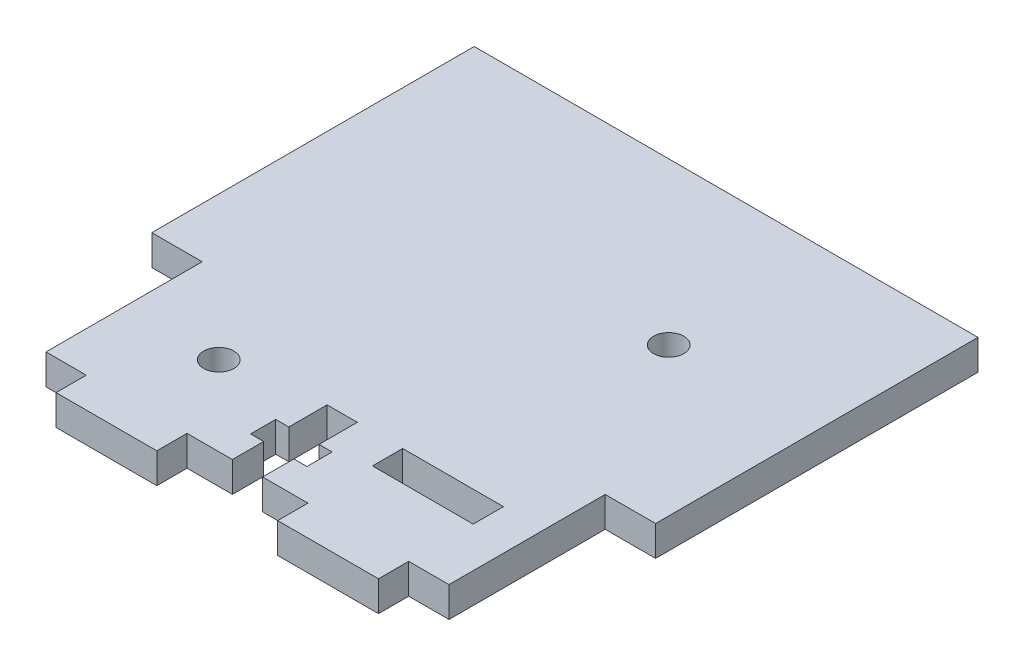
ISO-10303-21;
HEADER;
FILE_DESCRIPTION(('STEP AP214'),'2;1');
FILE_NAME('part.step','',(''),(''),'','','');
FILE_SCHEMA(('AUTOMOTIVE_DESIGN { 1 0 10303 214 1 1 1 1 }'));
ENDSEC;
DATA;
#1=APPLICATION_CONTEXT('core data for automotive mechanical design processes');
#2=APPLICATION_PROTOCOL_DEFINITION('international standard','automotive_design',2000,#1);
#3=PRODUCT_CONTEXT('',#1,'mechanical');
#4=PRODUCT('Part','Part','',(#3));
#5=PRODUCT_RELATED_PRODUCT_CATEGORY('part','',(#4));
#6=PRODUCT_DEFINITION_FORMATION('','',#4);
#7=PRODUCT_DEFINITION_CONTEXT('part definition',#1,'design');
#8=PRODUCT_DEFINITION('design','',#6,#7);
#9=PRODUCT_DEFINITION_SHAPE('','',#8);
#10=(LENGTH_UNIT() NAMED_UNIT(*) SI_UNIT(.MILLI.,.METRE.));
#11=(NAMED_UNIT(*) PLANE_ANGLE_UNIT() SI_UNIT($,.RADIAN.));
#12=(NAMED_UNIT(*) SI_UNIT($,.STERADIAN.) SOLID_ANGLE_UNIT());
#13=UNCERTAINTY_MEASURE_WITH_UNIT(LENGTH_MEASURE(1.E-05),#10,'distance_accuracy_value','');
#14=(GEOMETRIC_REPRESENTATION_CONTEXT(3) GLOBAL_UNCERTAINTY_ASSIGNED_CONTEXT((#13)) GLOBAL_UNIT_ASSIGNED_CONTEXT((#10,
#11,#12)) REPRESENTATION_CONTEXT('',''));
#15=CARTESIAN_POINT('',(0.,0.,0.));
#16=DIRECTION('',(0.,0.,1.));
#17=DIRECTION('',(1.,0.,0.));
#18=AXIS2_PLACEMENT_3D('',#15,#16,#17);
#19=CARTESIAN_POINT('',(0.,3.,0.));
#20=DIRECTION('',(0.,-1.,0.));
#21=DIRECTION('',(0.,0.,-1.));
#22=AXIS2_PLACEMENT_3D('',#19,#20,#21);
#23=PLANE('',#22);
#24=DIRECTION('',(0.,0.,-1.));
#25=VECTOR('',#24,1.);
#26=CARTESIAN_POINT('',(0.,3.,0.));
#27=LINE('',#26,#25);
#28=CARTESIAN_POINT('',(0.,3.,0.));
#29=VERTEX_POINT('',#28);
#30=CARTESIAN_POINT('',(0.,3.,-15.5));
#31=VERTEX_POINT('',#30);
#32=EDGE_CURVE('E281',#29,#31,#27,.T.);
#33=ORIENTED_EDGE('',*,*,#32,.T.);
#34=DIRECTION('',(1.,0.,0.));
#35=VECTOR('',#34,1.);
#36=CARTESIAN_POINT('',(0.,3.,-15.5));
#37=LINE('',#36,#35);
#38=CARTESIAN_POINT('',(4.99999999999999,3.,-15.5));
#39=VERTEX_POINT('',#38);
#40=EDGE_CURVE('E284',#31,#39,#37,.T.);
#41=ORIENTED_EDGE('',*,*,#40,.T.);
#42=DIRECTION('',(0.,0.,-1.));
#43=VECTOR('',#42,1.);
#44=CARTESIAN_POINT('',(4.99999999999999,3.,-15.5));
#45=LINE('',#44,#43);
#46=CARTESIAN_POINT('',(5.,3.,-47.5));
#47=VERTEX_POINT('',#46);
#48=EDGE_CURVE('E287',#39,#47,#45,.T.);
#49=ORIENTED_EDGE('',*,*,#48,.T.);
#50=DIRECTION('',(-1.,0.,0.));
#51=VECTOR('',#50,1.);
#52=CARTESIAN_POINT('',(5.,3.,-47.5));
#53=LINE('',#52,#51);
#54=CARTESIAN_POINT('',(-45.,3.,-47.5));
#55=VERTEX_POINT('',#54);
#56=EDGE_CURVE('E289',#47,#55,#53,.T.);
#57=ORIENTED_EDGE('',*,*,#56,.T.);
#58=DIRECTION('',(0.,0.,1.));
#59=VECTOR('',#58,1.);
#60=CARTESIAN_POINT('',(-45.,3.,-47.5));
#61=LINE('',#60,#59);
#62=CARTESIAN_POINT('',(-45.,3.,-15.5));
#63=VERTEX_POINT('',#62);
#64=EDGE_CURVE('E291',#55,#63,#61,.T.);
#65=ORIENTED_EDGE('',*,*,#64,.T.);
#66=DIRECTION('',(1.,0.,0.));
#67=VECTOR('',#66,1.);
#68=CARTESIAN_POINT('',(-45.,3.,-15.5));
#69=LINE('',#68,#67);
#70=CARTESIAN_POINT('',(-40.,3.,-15.5));
#71=VERTEX_POINT('',#70);
#72=EDGE_CURVE('E293',#63,#71,#69,.T.);
#73=ORIENTED_EDGE('',*,*,#72,.T.);
#74=DIRECTION('',(0.,0.,1.));
#75=VECTOR('',#74,1.);
#76=CARTESIAN_POINT('',(-40.,3.,0.));
#77=LINE('',#76,#75);
#78=CARTESIAN_POINT('',(-40.,3.,0.));
#79=VERTEX_POINT('',#78);
#80=EDGE_CURVE('E295',#71,#79,#77,.T.);
#81=ORIENTED_EDGE('',*,*,#80,.T.);
#82=DIRECTION('',(1.,0.,0.));
#83=VECTOR('',#82,1.);
#84=CARTESIAN_POINT('',(-36.,3.,0.));
#85=LINE('',#84,#83);
#86=CARTESIAN_POINT('',(-36.,3.,0.));
#87=VERTEX_POINT('',#86);
#88=EDGE_CURVE('E297',#79,#87,#85,.T.);
#89=ORIENTED_EDGE('',*,*,#88,.T.);
#90=DIRECTION('',(0.,0.,1.));
#91=VECTOR('',#90,1.);
#92=CARTESIAN_POINT('',(-36.,3.,0.));
#93=LINE('',#92,#91);
#94=CARTESIAN_POINT('',(-36.,3.,3.));
#95=VERTEX_POINT('',#94);
#96=EDGE_CURVE('E299',#87,#95,#93,.T.);
#97=ORIENTED_EDGE('',*,*,#96,.T.);
#98=DIRECTION('',(1.,0.,0.));
#99=VECTOR('',#98,1.);
#100=CARTESIAN_POINT('',(-36.,3.,3.));
#101=LINE('',#100,#99);
#102=CARTESIAN_POINT('',(-26.,3.,3.));
#103=VERTEX_POINT('',#102);
#104=EDGE_CURVE('E301',#95,#103,#101,.T.);
#105=ORIENTED_EDGE('',*,*,#104,.T.);
#106=DIRECTION('',(0.,0.,-1.));
#107=VECTOR('',#106,1.);
#108=CARTESIAN_POINT('',(-26.,3.,3.));
#109=LINE('',#108,#107);
#110=CARTESIAN_POINT('',(-26.,3.,0.));
#111=VERTEX_POINT('',#110);
#112=EDGE_CURVE('E303',#103,#111,#109,.T.);
#113=ORIENTED_EDGE('',*,*,#112,.T.);
#114=DIRECTION('',(1.,0.,0.));
#115=VECTOR('',#114,1.);
#116=CARTESIAN_POINT('',(-21.5,3.,0.));
#117=LINE('',#116,#115);
#118=CARTESIAN_POINT('',(-21.5,3.,0.));
#119=VERTEX_POINT('',#118);
#120=EDGE_CURVE('E305',#111,#119,#117,.T.);
#121=ORIENTED_EDGE('',*,*,#120,.T.);
#122=DIRECTION('',(0.,0.,-1.));
#123=VECTOR('',#122,1.);
#124=CARTESIAN_POINT('',(-21.5,3.,-3.1));
#125=LINE('',#124,#123);
#126=CARTESIAN_POINT('',(-21.5,3.,-3.1));
#127=VERTEX_POINT('',#126);
#128=EDGE_CURVE('E307',#119,#127,#125,.T.);
#129=ORIENTED_EDGE('',*,*,#128,.T.);
#130=DIRECTION('',(-1.,0.,0.));
#131=VECTOR('',#130,1.);
#132=CARTESIAN_POINT('',(-22.8,3.,-3.1));
#133=LINE('',#132,#131);
#134=CARTESIAN_POINT('',(-22.8,3.,-3.1));
#135=VERTEX_POINT('',#134);
#136=EDGE_CURVE('E309',#127,#135,#133,.T.);
#137=ORIENTED_EDGE('',*,*,#136,.T.);
#138=DIRECTION('',(0.,0.,-1.));
#139=VECTOR('',#138,1.);
#140=CARTESIAN_POINT('',(-22.8,3.,-5.6));
#141=LINE('',#140,#139);
#142=CARTESIAN_POINT('',(-22.8,3.,-5.6));
#143=VERTEX_POINT('',#142);
#144=EDGE_CURVE('E311',#135,#143,#141,.T.);
#145=ORIENTED_EDGE('',*,*,#144,.T.);
#146=DIRECTION('',(1.,0.,0.));
#147=VECTOR('',#146,1.);
#148=CARTESIAN_POINT('',(-21.5,3.,-5.6));
#149=LINE('',#148,#147);
#150=CARTESIAN_POINT('',(-21.5,3.,-5.6));
#151=VERTEX_POINT('',#150);
#152=EDGE_CURVE('E313',#143,#151,#149,.T.);
#153=ORIENTED_EDGE('',*,*,#152,.T.);
#154=DIRECTION('',(0.,0.,-1.));
#155=VECTOR('',#154,1.);
#156=CARTESIAN_POINT('',(-21.5,3.,-9.4));
#157=LINE('',#156,#155);
#158=CARTESIAN_POINT('',(-21.5,3.,-9.4));
#159=VERTEX_POINT('',#158);
#160=EDGE_CURVE('E315',#151,#159,#157,.T.);
#161=ORIENTED_EDGE('',*,*,#160,.T.);
#162=DIRECTION('',(1.,0.,0.));
#163=VECTOR('',#162,1.);
#164=CARTESIAN_POINT('',(-18.5,3.,-9.4));
#165=LINE('',#164,#163);
#166=CARTESIAN_POINT('',(-18.5,3.,-9.4));
#167=VERTEX_POINT('',#166);
#168=EDGE_CURVE('E317',#159,#167,#165,.T.);
#169=ORIENTED_EDGE('',*,*,#168,.T.);
#170=DIRECTION('',(0.,0.,1.));
#171=VECTOR('',#170,1.);
#172=CARTESIAN_POINT('',(-18.5,3.,-5.6));
#173=LINE('',#172,#171);
#174=CARTESIAN_POINT('',(-18.5,3.,-5.6));
#175=VERTEX_POINT('',#174);
#176=EDGE_CURVE('E319',#167,#175,#173,.T.);
#177=ORIENTED_EDGE('',*,*,#176,.T.);
#178=DIRECTION('',(1.,0.,0.));
#179=VECTOR('',#178,1.);
#180=CARTESIAN_POINT('',(-17.2,3.,-5.6));
#181=LINE('',#180,#179);
#182=CARTESIAN_POINT('',(-17.2,3.,-5.6));
#183=VERTEX_POINT('',#182);
#184=EDGE_CURVE('E321',#175,#183,#181,.T.);
#185=ORIENTED_EDGE('',*,*,#184,.T.);
#186=DIRECTION('',(0.,0.,1.));
#187=VECTOR('',#186,1.);
#188=CARTESIAN_POINT('',(-17.2,3.,-3.1));
#189=LINE('',#188,#187);
#190=CARTESIAN_POINT('',(-17.2,3.,-3.1));
#191=VERTEX_POINT('',#190);
#192=EDGE_CURVE('E323',#183,#191,#189,.T.);
#193=ORIENTED_EDGE('',*,*,#192,.T.);
#194=DIRECTION('',(-1.,0.,0.));
#195=VECTOR('',#194,1.);
#196=CARTESIAN_POINT('',(-18.5,3.,-3.1));
#197=LINE('',#196,#195);
#198=CARTESIAN_POINT('',(-18.5,3.,-3.1));
#199=VERTEX_POINT('',#198);
#200=EDGE_CURVE('E325',#191,#199,#197,.T.);
#201=ORIENTED_EDGE('',*,*,#200,.T.);
#202=DIRECTION('',(0.,0.,1.));
#203=VECTOR('',#202,1.);
#204=CARTESIAN_POINT('',(-18.5,3.,0.));
#205=LINE('',#204,#203);
#206=CARTESIAN_POINT('',(-18.5,3.,0.));
#207=VERTEX_POINT('',#206);
#208=EDGE_CURVE('E327',#199,#207,#205,.T.);
#209=ORIENTED_EDGE('',*,*,#208,.T.);
#210=DIRECTION('',(1.,0.,0.));
#211=VECTOR('',#210,1.);
#212=CARTESIAN_POINT('',(-14.,3.,0.));
#213=LINE('',#212,#211);
#214=CARTESIAN_POINT('',(-14.,3.,0.));
#215=VERTEX_POINT('',#214);
#216=EDGE_CURVE('E329',#207,#215,#213,.T.);
#217=ORIENTED_EDGE('',*,*,#216,.T.);
#218=DIRECTION('',(0.,0.,1.));
#219=VECTOR('',#218,1.);
#220=CARTESIAN_POINT('',(-14.,3.,3.));
#221=LINE('',#220,#219);
#222=CARTESIAN_POINT('',(-14.,3.,3.));
#223=VERTEX_POINT('',#222);
#224=EDGE_CURVE('E331',#215,#223,#221,.T.);
#225=ORIENTED_EDGE('',*,*,#224,.T.);
#226=DIRECTION('',(1.,0.,0.));
#227=VECTOR('',#226,1.);
#228=CARTESIAN_POINT('',(-4.,3.,3.));
#229=LINE('',#228,#227);
#230=CARTESIAN_POINT('',(-4.,3.,3.));
#231=VERTEX_POINT('',#230);
#232=EDGE_CURVE('E333',#223,#231,#229,.T.);
#233=ORIENTED_EDGE('',*,*,#232,.T.);
#234=DIRECTION('',(0.,0.,-1.));
#235=VECTOR('',#234,1.);
#236=CARTESIAN_POINT('',(-4.,3.,0.));
#237=LINE('',#236,#235);
#238=CARTESIAN_POINT('',(-4.,3.,0.));
#239=VERTEX_POINT('',#238);
#240=EDGE_CURVE('E335',#231,#239,#237,.T.);
#241=ORIENTED_EDGE('',*,*,#240,.T.);
#242=DIRECTION('',(1.,0.,0.));
#243=VECTOR('',#242,1.);
#244=CARTESIAN_POINT('',(0.,3.,0.));
#245=LINE('',#244,#243);
#246=EDGE_CURVE('E337',#239,#29,#245,.T.);
#247=ORIENTED_EDGE('',*,*,#246,.T.);
#248=EDGE_LOOP('',(#33,#41,#49,#57,#65,#73,#81,#89,#97,#105,#113,#121,#129,#137,#145,#153,#161,
#169,#177,#185,#193,#201,#209,#217,#225,#233,#241,#247));
#249=FACE_BOUND('',#248,.T.);
#250=DIRECTION('',(-1.,0.,0.));
#251=VECTOR('',#250,1.);
#252=CARTESIAN_POINT('',(-4.,3.,-9.4));
#253=LINE('',#252,#251);
#254=CARTESIAN_POINT('',(-4.,3.,-9.4));
#255=VERTEX_POINT('',#254);
#256=CARTESIAN_POINT('',(-14.,3.,-9.4));
#257=VERTEX_POINT('',#256);
#258=EDGE_CURVE('E242',#255,#257,#253,.T.);
#259=ORIENTED_EDGE('',*,*,#258,.F.);
#260=DIRECTION('',(0.,0.,-1.));
#261=VECTOR('',#260,1.);
#262=CARTESIAN_POINT('',(-4.,3.,-6.4));
#263=LINE('',#262,#261);
#264=CARTESIAN_POINT('',(-4.,3.,-6.4));
#265=VERTEX_POINT('',#264);
#266=EDGE_CURVE('E265',#265,#255,#263,.T.);
#267=ORIENTED_EDGE('',*,*,#266,.F.);
#268=DIRECTION('',(1.,0.,0.));
#269=VECTOR('',#268,1.);
#270=CARTESIAN_POINT('',(-14.,3.,-6.4));
#271=LINE('',#270,#269);
#272=CARTESIAN_POINT('',(-14.,3.,-6.4));
#273=VERTEX_POINT('',#272);
#274=EDGE_CURVE('E263',#273,#265,#271,.T.);
#275=ORIENTED_EDGE('',*,*,#274,.F.);
#276=DIRECTION('',(0.,0.,1.));
#277=VECTOR('',#276,1.);
#278=CARTESIAN_POINT('',(-14.,3.,-9.4));
#279=LINE('',#278,#277);
#280=EDGE_CURVE('E250',#257,#273,#279,.T.);
#281=ORIENTED_EDGE('',*,*,#280,.F.);
#282=EDGE_LOOP('',(#259,#267,#275,#281));
#283=FACE_BOUND('',#282,.T.);
#284=CARTESIAN_POINT('',(-9.7,3.,-31.5));
#285=DIRECTION('',(0.,1.,0.));
#286=DIRECTION('',(0.,0.,1.));
#287=AXIS2_PLACEMENT_3D('',#284,#285,#286);
#288=CIRCLE('',#287,1.5);
#289=CARTESIAN_POINT('',(-9.7,3.,-30.));
#290=VERTEX_POINT('',#289);
#291=EDGE_CURVE('E271',#290,#290,#288,.T.);
#292=ORIENTED_EDGE('',*,*,#291,.F.);
#293=EDGE_LOOP('',(#292));
#294=FACE_BOUND('',#293,.T.);
#295=CARTESIAN_POINT('',(-30.75,3.,-7.9));
#296=DIRECTION('',(0.,1.,0.));
#297=DIRECTION('',(0.,0.,1.));
#298=AXIS2_PLACEMENT_3D('',#295,#296,#297);
#299=CIRCLE('',#298,1.5);
#300=CARTESIAN_POINT('',(-30.75,3.,-6.4));
#301=VERTEX_POINT('',#300);
#302=EDGE_CURVE('E910',#301,#301,#299,.T.);
#303=ORIENTED_EDGE('',*,*,#302,.F.);
#304=EDGE_LOOP('',(#303));
#305=FACE_BOUND('',#304,.T.);
#306=ADVANCED_FACE('F33',(#249,#283,#294,#305),#23,.F.);
#307=CARTESIAN_POINT('',(0.,0.,0.));
#308=DIRECTION('',(0.,-1.,0.));
#309=DIRECTION('',(0.,0.,-1.));
#310=AXIS2_PLACEMENT_3D('',#307,#308,#309);
#311=PLANE('',#310);
#312=CARTESIAN_POINT('',(-9.7,0.,-31.5));
#313=DIRECTION('',(0.,1.,0.));
#314=DIRECTION('',(0.,0.,1.));
#315=AXIS2_PLACEMENT_3D('',#312,#313,#314);
#316=CIRCLE('',#315,1.5);
#317=CARTESIAN_POINT('',(-9.7,0.,-30.));
#318=VERTEX_POINT('',#317);
#319=EDGE_CURVE('E916',#318,#318,#316,.T.);
#320=ORIENTED_EDGE('',*,*,#319,.T.);
#321=EDGE_LOOP('',(#320));
#322=FACE_BOUND('',#321,.T.);
#323=DIRECTION('',(0.,0.,-1.));
#324=VECTOR('',#323,1.);
#325=CARTESIAN_POINT('',(0.,0.,0.));
#326=LINE('',#325,#324);
#327=CARTESIAN_POINT('',(0.,0.,0.));
#328=VERTEX_POINT('',#327);
#329=CARTESIAN_POINT('',(0.,0.,-15.5));
#330=VERTEX_POINT('',#329);
#331=EDGE_CURVE('E258',#328,#330,#326,.T.);
#332=ORIENTED_EDGE('',*,*,#331,.F.);
#333=DIRECTION('',(1.,0.,0.));
#334=VECTOR('',#333,1.);
#335=CARTESIAN_POINT('',(0.,0.,0.));
#336=LINE('',#335,#334);
#337=CARTESIAN_POINT('',(-4.,0.,0.));
#338=VERTEX_POINT('',#337);
#339=EDGE_CURVE('E285',#338,#328,#336,.T.);
#340=ORIENTED_EDGE('',*,*,#339,.F.);
#341=DIRECTION('',(0.,0.,-1.));
#342=VECTOR('',#341,1.);
#343=CARTESIAN_POINT('',(-4.,0.,0.));
#344=LINE('',#343,#342);
#345=CARTESIAN_POINT('',(-4.,0.,3.));
#346=VERTEX_POINT('',#345);
#347=EDGE_CURVE('E392',#346,#338,#344,.T.);
#348=ORIENTED_EDGE('',*,*,#347,.F.);
#349=DIRECTION('',(1.,0.,0.));
#350=VECTOR('',#349,1.);
#351=CARTESIAN_POINT('',(-4.,0.,3.));
#352=LINE('',#351,#350);
#353=CARTESIAN_POINT('',(-14.,0.,3.));
#354=VERTEX_POINT('',#353);
#355=EDGE_CURVE('E390',#354,#346,#352,.T.);
#356=ORIENTED_EDGE('',*,*,#355,.F.);
#357=DIRECTION('',(0.,0.,1.));
#358=VECTOR('',#357,1.);
#359=CARTESIAN_POINT('',(-14.,0.,3.));
#360=LINE('',#359,#358);
#361=CARTESIAN_POINT('',(-14.,0.,0.));
#362=VERTEX_POINT('',#361);
#363=EDGE_CURVE('E388',#362,#354,#360,.T.);
#364=ORIENTED_EDGE('',*,*,#363,.F.);
#365=DIRECTION('',(1.,0.,0.));
#366=VECTOR('',#365,1.);
#367=CARTESIAN_POINT('',(-14.,0.,0.));
#368=LINE('',#367,#366);
#369=CARTESIAN_POINT('',(-18.5,0.,0.));
#370=VERTEX_POINT('',#369);
#371=EDGE_CURVE('E386',#370,#362,#368,.T.);
#372=ORIENTED_EDGE('',*,*,#371,.F.);
#373=DIRECTION('',(0.,0.,1.));
#374=VECTOR('',#373,1.);
#375=CARTESIAN_POINT('',(-18.5,0.,0.));
#376=LINE('',#375,#374);
#377=CARTESIAN_POINT('',(-18.5,0.,-3.1));
#378=VERTEX_POINT('',#377);
#379=EDGE_CURVE('E384',#378,#370,#376,.T.);
#380=ORIENTED_EDGE('',*,*,#379,.F.);
#381=DIRECTION('',(-1.,0.,0.));
#382=VECTOR('',#381,1.);
#383=CARTESIAN_POINT('',(-18.5,0.,-3.1));
#384=LINE('',#383,#382);
#385=CARTESIAN_POINT('',(-17.2,0.,-3.1));
#386=VERTEX_POINT('',#385);
#387=EDGE_CURVE('E382',#386,#378,#384,.T.);
#388=ORIENTED_EDGE('',*,*,#387,.F.);
#389=DIRECTION('',(0.,0.,1.));
#390=VECTOR('',#389,1.);
#391=CARTESIAN_POINT('',(-17.2,0.,-3.1));
#392=LINE('',#391,#390);
#393=CARTESIAN_POINT('',(-17.2,0.,-5.6));
#394=VERTEX_POINT('',#393);
#395=EDGE_CURVE('E380',#394,#386,#392,.T.);
#396=ORIENTED_EDGE('',*,*,#395,.F.);
#397=DIRECTION('',(1.,0.,0.));
#398=VECTOR('',#397,1.);
#399=CARTESIAN_POINT('',(-17.2,0.,-5.6));
#400=LINE('',#399,#398);
#401=CARTESIAN_POINT('',(-18.5,0.,-5.6));
#402=VERTEX_POINT('',#401);
#403=EDGE_CURVE('E378',#402,#394,#400,.T.);
#404=ORIENTED_EDGE('',*,*,#403,.F.);
#405=DIRECTION('',(0.,0.,1.));
#406=VECTOR('',#405,1.);
#407=CARTESIAN_POINT('',(-18.5,0.,-5.6));
#408=LINE('',#407,#406);
#409=CARTESIAN_POINT('',(-18.5,0.,-9.4));
#410=VERTEX_POINT('',#409);
#411=EDGE_CURVE('E376',#410,#402,#408,.T.);
#412=ORIENTED_EDGE('',*,*,#411,.F.);
#413=DIRECTION('',(1.,0.,0.));
#414=VECTOR('',#413,1.);
#415=CARTESIAN_POINT('',(-18.5,0.,-9.4));
#416=LINE('',#415,#414);
#417=CARTESIAN_POINT('',(-21.5,0.,-9.4));
#418=VERTEX_POINT('',#417);
#419=EDGE_CURVE('E374',#418,#410,#416,.T.);
#420=ORIENTED_EDGE('',*,*,#419,.F.);
#421=DIRECTION('',(0.,0.,-1.));
#422=VECTOR('',#421,1.);
#423=CARTESIAN_POINT('',(-21.5,0.,-9.4));
#424=LINE('',#423,#422);
#425=CARTESIAN_POINT('',(-21.5,0.,-5.6));
#426=VERTEX_POINT('',#425);
#427=EDGE_CURVE('E372',#426,#418,#424,.T.);
#428=ORIENTED_EDGE('',*,*,#427,.F.);
#429=DIRECTION('',(1.,0.,0.));
#430=VECTOR('',#429,1.);
#431=CARTESIAN_POINT('',(-21.5,0.,-5.6));
#432=LINE('',#431,#430);
#433=CARTESIAN_POINT('',(-22.8,0.,-5.6));
#434=VERTEX_POINT('',#433);
#435=EDGE_CURVE('E370',#434,#426,#432,.T.);
#436=ORIENTED_EDGE('',*,*,#435,.F.);
#437=DIRECTION('',(0.,0.,-1.));
#438=VECTOR('',#437,1.);
#439=CARTESIAN_POINT('',(-22.8,0.,-5.6));
#440=LINE('',#439,#438);
#441=CARTESIAN_POINT('',(-22.8,0.,-3.1));
#442=VERTEX_POINT('',#441);
#443=EDGE_CURVE('E368',#442,#434,#440,.T.);
#444=ORIENTED_EDGE('',*,*,#443,.F.);
#445=DIRECTION('',(-1.,0.,0.));
#446=VECTOR('',#445,1.);
#447=CARTESIAN_POINT('',(-22.8,0.,-3.1));
#448=LINE('',#447,#446);
#449=CARTESIAN_POINT('',(-21.5,0.,-3.1));
#450=VERTEX_POINT('',#449);
#451=EDGE_CURVE('E366',#450,#442,#448,.T.);
#452=ORIENTED_EDGE('',*,*,#451,.F.);
#453=DIRECTION('',(0.,0.,-1.));
#454=VECTOR('',#453,1.);
#455=CARTESIAN_POINT('',(-21.5,0.,-3.1));
#456=LINE('',#455,#454);
#457=CARTESIAN_POINT('',(-21.5,0.,0.));
#458=VERTEX_POINT('',#457);
#459=EDGE_CURVE('E364',#458,#450,#456,.T.);
#460=ORIENTED_EDGE('',*,*,#459,.F.);
#461=DIRECTION('',(1.,0.,0.));
#462=VECTOR('',#461,1.);
#463=CARTESIAN_POINT('',(-21.5,0.,0.));
#464=LINE('',#463,#462);
#465=CARTESIAN_POINT('',(-26.,0.,0.));
#466=VERTEX_POINT('',#465);
#467=EDGE_CURVE('E362',#466,#458,#464,.T.);
#468=ORIENTED_EDGE('',*,*,#467,.F.);
#469=DIRECTION('',(0.,0.,-1.));
#470=VECTOR('',#469,1.);
#471=CARTESIAN_POINT('',(-26.,0.,3.));
#472=LINE('',#471,#470);
#473=CARTESIAN_POINT('',(-26.,0.,3.));
#474=VERTEX_POINT('',#473);
#475=EDGE_CURVE('E360',#474,#466,#472,.T.);
#476=ORIENTED_EDGE('',*,*,#475,.F.);
#477=DIRECTION('',(1.,0.,0.));
#478=VECTOR('',#477,1.);
#479=CARTESIAN_POINT('',(-36.,0.,3.));
#480=LINE('',#479,#478);
#481=CARTESIAN_POINT('',(-36.,0.,3.));
#482=VERTEX_POINT('',#481);
#483=EDGE_CURVE('E358',#482,#474,#480,.T.);
#484=ORIENTED_EDGE('',*,*,#483,.F.);
#485=DIRECTION('',(0.,0.,1.));
#486=VECTOR('',#485,1.);
#487=CARTESIAN_POINT('',(-36.,0.,0.));
#488=LINE('',#487,#486);
#489=CARTESIAN_POINT('',(-36.,0.,0.));
#490=VERTEX_POINT('',#489);
#491=EDGE_CURVE('E356',#490,#482,#488,.T.);
#492=ORIENTED_EDGE('',*,*,#491,.F.);
#493=DIRECTION('',(1.,0.,0.));
#494=VECTOR('',#493,1.);
#495=CARTESIAN_POINT('',(-36.,0.,0.));
#496=LINE('',#495,#494);
#497=CARTESIAN_POINT('',(-40.,0.,0.));
#498=VERTEX_POINT('',#497);
#499=EDGE_CURVE('E354',#498,#490,#496,.T.);
#500=ORIENTED_EDGE('',*,*,#499,.F.);
#501=DIRECTION('',(0.,0.,1.));
#502=VECTOR('',#501,1.);
#503=CARTESIAN_POINT('',(-40.,0.,0.));
#504=LINE('',#503,#502);
#505=CARTESIAN_POINT('',(-40.,0.,-15.5));
#506=VERTEX_POINT('',#505);
#507=EDGE_CURVE('E352',#506,#498,#504,.T.);
#508=ORIENTED_EDGE('',*,*,#507,.F.);
#509=DIRECTION('',(1.,0.,0.));
#510=VECTOR('',#509,1.);
#511=CARTESIAN_POINT('',(-45.,0.,-15.5));
#512=LINE('',#511,#510);
#513=CARTESIAN_POINT('',(-45.,0.,-15.5));
#514=VERTEX_POINT('',#513);
#515=EDGE_CURVE('E350',#514,#506,#512,.T.);
#516=ORIENTED_EDGE('',*,*,#515,.F.);
#517=DIRECTION('',(0.,0.,1.));
#518=VECTOR('',#517,1.);
#519=CARTESIAN_POINT('',(-45.,0.,-47.5));
#520=LINE('',#519,#518);
#521=CARTESIAN_POINT('',(-45.,0.,-47.5));
#522=VERTEX_POINT('',#521);
#523=EDGE_CURVE('E348',#522,#514,#520,.T.);
#524=ORIENTED_EDGE('',*,*,#523,.F.);
#525=DIRECTION('',(-1.,0.,0.));
#526=VECTOR('',#525,1.);
#527=CARTESIAN_POINT('',(5.,0.,-47.5));
#528=LINE('',#527,#526);
#529=CARTESIAN_POINT('',(5.,0.,-47.5));
#530=VERTEX_POINT('',#529);
#531=EDGE_CURVE('E346',#530,#522,#528,.T.);
#532=ORIENTED_EDGE('',*,*,#531,.F.);
#533=DIRECTION('',(0.,0.,-1.));
#534=VECTOR('',#533,1.);
#535=CARTESIAN_POINT('',(4.99999999999999,0.,-15.5));
#536=LINE('',#535,#534);
#537=CARTESIAN_POINT('',(4.99999999999999,0.,-15.5));
#538=VERTEX_POINT('',#537);
#539=EDGE_CURVE('E344',#538,#530,#536,.T.);
#540=ORIENTED_EDGE('',*,*,#539,.F.);
#541=DIRECTION('',(1.,0.,0.));
#542=VECTOR('',#541,1.);
#543=CARTESIAN_POINT('',(0.,0.,-15.5));
#544=LINE('',#543,#542);
#545=EDGE_CURVE('E342',#330,#538,#544,.T.);
#546=ORIENTED_EDGE('',*,*,#545,.F.);
#547=EDGE_LOOP('',(#332,#340,#348,#356,#364,#372,#380,#388,#396,#404,#412,#420,#428,#436,#444,
#452,#460,#468,#476,#484,#492,#500,#508,#516,#524,#532,#540,#546));
#548=FACE_BOUND('',#547,.T.);
#549=DIRECTION('',(0.,0.,-1.));
#550=VECTOR('',#549,1.);
#551=CARTESIAN_POINT('',(-4.,0.,-6.4));
#552=LINE('',#551,#550);
#553=CARTESIAN_POINT('',(-4.,0.,-6.4));
#554=VERTEX_POINT('',#553);
#555=CARTESIAN_POINT('',(-4.,0.,-9.4));
#556=VERTEX_POINT('',#555);
#557=EDGE_CURVE('E251',#554,#556,#552,.T.);
#558=ORIENTED_EDGE('',*,*,#557,.T.);
#559=DIRECTION('',(-1.,0.,0.));
#560=VECTOR('',#559,1.);
#561=CARTESIAN_POINT('',(-4.,0.,-9.4));
#562=LINE('',#561,#560);
#563=CARTESIAN_POINT('',(-14.,0.,-9.4));
#564=VERTEX_POINT('',#563);
#565=EDGE_CURVE('E56',#556,#564,#562,.T.);
#566=ORIENTED_EDGE('',*,*,#565,.T.);
#567=DIRECTION('',(0.,0.,1.));
#568=VECTOR('',#567,1.);
#569=CARTESIAN_POINT('',(-14.,0.,-9.4));
#570=LINE('',#569,#568);
#571=CARTESIAN_POINT('',(-14.,0.,-6.4));
#572=VERTEX_POINT('',#571);
#573=EDGE_CURVE('E257',#564,#572,#570,.T.);
#574=ORIENTED_EDGE('',*,*,#573,.T.);
#575=DIRECTION('',(1.,0.,0.));
#576=VECTOR('',#575,1.);
#577=CARTESIAN_POINT('',(-14.,0.,-6.4));
#578=LINE('',#577,#576);
#579=EDGE_CURVE('E273',#572,#554,#578,.T.);
#580=ORIENTED_EDGE('',*,*,#579,.T.);
#581=EDGE_LOOP('',(#558,#566,#574,#580));
#582=FACE_BOUND('',#581,.T.);
#583=CARTESIAN_POINT('',(-30.75,0.,-7.9));
#584=DIRECTION('',(0.,1.,0.));
#585=DIRECTION('',(0.,0.,1.));
#586=AXIS2_PLACEMENT_3D('',#583,#584,#585);
#587=CIRCLE('',#586,1.5);
#588=CARTESIAN_POINT('',(-30.75,0.,-6.4));
#589=VERTEX_POINT('',#588);
#590=EDGE_CURVE('E913',#589,#589,#587,.T.);
#591=ORIENTED_EDGE('',*,*,#590,.T.);
#592=EDGE_LOOP('',(#591));
#593=FACE_BOUND('',#592,.T.);
#594=ADVANCED_FACE('F482',(#322,#548,#582,#593),#311,.T.);
#595=CARTESIAN_POINT('',(0.,3.,0.));
#596=DIRECTION('',(-1.,0.,0.));
#597=DIRECTION('',(0.,0.,1.));
#598=AXIS2_PLACEMENT_3D('',#595,#596,#597);
#599=PLANE('',#598);
#600=ORIENTED_EDGE('',*,*,#331,.T.);
#601=DIRECTION('',(0.,-1.,0.));
#602=VECTOR('',#601,1.);
#603=CARTESIAN_POINT('',(0.,3.,-15.5));
#604=LINE('',#603,#602);
#605=EDGE_CURVE('E11',#31,#330,#604,.T.);
#606=ORIENTED_EDGE('',*,*,#605,.F.);
#607=ORIENTED_EDGE('',*,*,#32,.F.);
#608=DIRECTION('',(0.,-1.,0.));
#609=VECTOR('',#608,1.);
#610=CARTESIAN_POINT('',(0.,3.,0.));
#611=LINE('',#610,#609);
#612=EDGE_CURVE('E339',#29,#328,#611,.T.);
#613=ORIENTED_EDGE('',*,*,#612,.T.);
#614=EDGE_LOOP('',(#600,#606,#607,#613));
#615=FACE_BOUND('',#614,.T.);
#616=ADVANCED_FACE('F35',(#615),#599,.F.);
#617=CARTESIAN_POINT('',(0.,3.,-15.5));
#618=DIRECTION('',(0.,0.,-1.));
#619=DIRECTION('',(-1.,0.,0.));
#620=AXIS2_PLACEMENT_3D('',#617,#618,#619);
#621=PLANE('',#620);
#622=ORIENTED_EDGE('',*,*,#545,.T.);
#623=DIRECTION('',(0.,-1.,0.));
#624=VECTOR('',#623,1.);
#625=CARTESIAN_POINT('',(4.99999999999999,3.,-15.5));
#626=LINE('',#625,#624);
#627=EDGE_CURVE('E41',#39,#538,#626,.T.);
#628=ORIENTED_EDGE('',*,*,#627,.F.);
#629=ORIENTED_EDGE('',*,*,#40,.F.);
#630=ORIENTED_EDGE('',*,*,#605,.T.);
#631=EDGE_LOOP('',(#622,#628,#629,#630));
#632=FACE_BOUND('',#631,.T.);
#633=ADVANCED_FACE('F499',(#632),#621,.F.);
#634=CARTESIAN_POINT('',(4.99999999999999,3.,-15.5));
#635=DIRECTION('',(-1.,0.,0.));
#636=DIRECTION('',(0.,0.,1.));
#637=AXIS2_PLACEMENT_3D('',#634,#635,#636);
#638=PLANE('',#637);
#639=ORIENTED_EDGE('',*,*,#539,.T.);
#640=DIRECTION('',(0.,-1.,0.));
#641=VECTOR('',#640,1.);
#642=CARTESIAN_POINT('',(5.,3.,-47.5));
#643=LINE('',#642,#641);
#644=EDGE_CURVE('E469',#47,#530,#643,.T.);
#645=ORIENTED_EDGE('',*,*,#644,.F.);
#646=ORIENTED_EDGE('',*,*,#48,.F.);
#647=ORIENTED_EDGE('',*,*,#627,.T.);
#648=EDGE_LOOP('',(#639,#645,#646,#647));
#649=FACE_BOUND('',#648,.T.);
#650=ADVANCED_FACE('F476',(#649),#638,.F.);
#651=CARTESIAN_POINT('',(5.,3.,-47.5));
#652=DIRECTION('',(0.,0.,1.));
#653=DIRECTION('',(1.,0.,0.));
#654=AXIS2_PLACEMENT_3D('',#651,#652,#653);
#655=PLANE('',#654);
#656=ORIENTED_EDGE('',*,*,#531,.T.);
#657=DIRECTION('',(0.,-1.,0.));
#658=VECTOR('',#657,1.);
#659=CARTESIAN_POINT('',(-45.,3.,-47.5));
#660=LINE('',#659,#658);
#661=EDGE_CURVE('E466',#55,#522,#660,.T.);
#662=ORIENTED_EDGE('',*,*,#661,.F.);
#663=ORIENTED_EDGE('',*,*,#56,.F.);
#664=ORIENTED_EDGE('',*,*,#644,.T.);
#665=EDGE_LOOP('',(#656,#662,#663,#664));
#666=FACE_BOUND('',#665,.T.);
#667=ADVANCED_FACE('F488',(#666),#655,.F.);
#668=CARTESIAN_POINT('',(-45.,3.,-47.5));
#669=DIRECTION('',(1.,0.,0.));
#670=DIRECTION('',(0.,0.,-1.));
#671=AXIS2_PLACEMENT_3D('',#668,#669,#670);
#672=PLANE('',#671);
#673=ORIENTED_EDGE('',*,*,#523,.T.);
#674=DIRECTION('',(0.,-1.,0.));
#675=VECTOR('',#674,1.);
#676=CARTESIAN_POINT('',(-45.,3.,-15.5));
#677=LINE('',#676,#675);
#678=EDGE_CURVE('E463',#63,#514,#677,.T.);
#679=ORIENTED_EDGE('',*,*,#678,.F.);
#680=ORIENTED_EDGE('',*,*,#64,.F.);
#681=ORIENTED_EDGE('',*,*,#661,.T.);
#682=EDGE_LOOP('',(#673,#679,#680,#681));
#683=FACE_BOUND('',#682,.T.);
#684=ADVANCED_FACE('F492',(#683),#672,.F.);
#685=CARTESIAN_POINT('',(-45.,3.,-15.5));
#686=DIRECTION('',(0.,0.,-1.));
#687=DIRECTION('',(-1.,0.,0.));
#688=AXIS2_PLACEMENT_3D('',#685,#686,#687);
#689=PLANE('',#688);
#690=ORIENTED_EDGE('',*,*,#515,.T.);
#691=DIRECTION('',(0.,-1.,0.));
#692=VECTOR('',#691,1.);
#693=CARTESIAN_POINT('',(-40.,3.,-15.5));
#694=LINE('',#693,#692);
#695=EDGE_CURVE('E460',#71,#506,#694,.T.);
#696=ORIENTED_EDGE('',*,*,#695,.F.);
#697=ORIENTED_EDGE('',*,*,#72,.F.);
#698=ORIENTED_EDGE('',*,*,#678,.T.);
#699=EDGE_LOOP('',(#690,#696,#697,#698));
#700=FACE_BOUND('',#699,.T.);
#701=ADVANCED_FACE('F612',(#700),#689,.F.);
#702=CARTESIAN_POINT('',(-40.,3.,0.));
#703=DIRECTION('',(1.,0.,0.));
#704=DIRECTION('',(0.,0.,-1.));
#705=AXIS2_PLACEMENT_3D('',#702,#703,#704);
#706=PLANE('',#705);
#707=ORIENTED_EDGE('',*,*,#507,.T.);
#708=DIRECTION('',(0.,-1.,0.));
#709=VECTOR('',#708,1.);
#710=CARTESIAN_POINT('',(-40.,3.,0.));
#711=LINE('',#710,#709);
#712=EDGE_CURVE('E457',#79,#498,#711,.T.);
#713=ORIENTED_EDGE('',*,*,#712,.F.);
#714=ORIENTED_EDGE('',*,*,#80,.F.);
#715=ORIENTED_EDGE('',*,*,#695,.T.);
#716=EDGE_LOOP('',(#707,#713,#714,#715));
#717=FACE_BOUND('',#716,.T.);
#718=ADVANCED_FACE('F609',(#717),#706,.F.);
#719=CARTESIAN_POINT('',(-36.,3.,0.));
#720=DIRECTION('',(0.,0.,-1.));
#721=DIRECTION('',(-1.,0.,0.));
#722=AXIS2_PLACEMENT_3D('',#719,#720,#721);
#723=PLANE('',#722);
#724=ORIENTED_EDGE('',*,*,#499,.T.);
#725=DIRECTION('',(0.,-1.,0.));
#726=VECTOR('',#725,1.);
#727=CARTESIAN_POINT('',(-36.,3.,0.));
#728=LINE('',#727,#726);
#729=EDGE_CURVE('E454',#87,#490,#728,.T.);
#730=ORIENTED_EDGE('',*,*,#729,.F.);
#731=ORIENTED_EDGE('',*,*,#88,.F.);
#732=ORIENTED_EDGE('',*,*,#712,.T.);
#733=EDGE_LOOP('',(#724,#730,#731,#732));
#734=FACE_BOUND('',#733,.T.);
#735=ADVANCED_FACE('F605',(#734),#723,.F.);
#736=CARTESIAN_POINT('',(-36.,3.,0.));
#737=DIRECTION('',(1.,0.,0.));
#738=DIRECTION('',(0.,0.,-1.));
#739=AXIS2_PLACEMENT_3D('',#736,#737,#738);
#740=PLANE('',#739);
#741=ORIENTED_EDGE('',*,*,#491,.T.);
#742=DIRECTION('',(0.,-1.,0.));
#743=VECTOR('',#742,1.);
#744=CARTESIAN_POINT('',(-36.,3.,3.));
#745=LINE('',#744,#743);
#746=EDGE_CURVE('E451',#95,#482,#745,.T.);
#747=ORIENTED_EDGE('',*,*,#746,.F.);
#748=ORIENTED_EDGE('',*,*,#96,.F.);
#749=ORIENTED_EDGE('',*,*,#729,.T.);
#750=EDGE_LOOP('',(#741,#747,#748,#749));
#751=FACE_BOUND('',#750,.T.);
#752=ADVANCED_FACE('F601',(#751),#740,.F.);
#753=CARTESIAN_POINT('',(-36.,3.,3.));
#754=DIRECTION('',(0.,0.,-1.));
#755=DIRECTION('',(-1.,0.,0.));
#756=AXIS2_PLACEMENT_3D('',#753,#754,#755);
#757=PLANE('',#756);
#758=ORIENTED_EDGE('',*,*,#483,.T.);
#759=DIRECTION('',(0.,-1.,0.));
#760=VECTOR('',#759,1.);
#761=CARTESIAN_POINT('',(-26.,3.,3.));
#762=LINE('',#761,#760);
#763=EDGE_CURVE('E448',#103,#474,#762,.T.);
#764=ORIENTED_EDGE('',*,*,#763,.F.);
#765=ORIENTED_EDGE('',*,*,#104,.F.);
#766=ORIENTED_EDGE('',*,*,#746,.T.);
#767=EDGE_LOOP('',(#758,#764,#765,#766));
#768=FACE_BOUND('',#767,.T.);
#769=ADVANCED_FACE('F596',(#768),#757,.F.);
#770=CARTESIAN_POINT('',(-26.,3.,3.));
#771=DIRECTION('',(-1.,0.,0.));
#772=DIRECTION('',(0.,0.,1.));
#773=AXIS2_PLACEMENT_3D('',#770,#771,#772);
#774=PLANE('',#773);
#775=ORIENTED_EDGE('',*,*,#475,.T.);
#776=DIRECTION('',(0.,-1.,0.));
#777=VECTOR('',#776,1.);
#778=CARTESIAN_POINT('',(-26.,3.,0.));
#779=LINE('',#778,#777);
#780=EDGE_CURVE('E445',#111,#466,#779,.T.);
#781=ORIENTED_EDGE('',*,*,#780,.F.);
#782=ORIENTED_EDGE('',*,*,#112,.F.);
#783=ORIENTED_EDGE('',*,*,#763,.T.);
#784=EDGE_LOOP('',(#775,#781,#782,#783));
#785=FACE_BOUND('',#784,.T.);
#786=ADVANCED_FACE('F590',(#785),#774,.F.);
#787=CARTESIAN_POINT('',(-21.5,3.,0.));
#788=DIRECTION('',(0.,0.,-1.));
#789=DIRECTION('',(-1.,0.,0.));
#790=AXIS2_PLACEMENT_3D('',#787,#788,#789);
#791=PLANE('',#790);
#792=ORIENTED_EDGE('',*,*,#467,.T.);
#793=DIRECTION('',(0.,-1.,0.));
#794=VECTOR('',#793,1.);
#795=CARTESIAN_POINT('',(-21.5,3.,0.));
#796=LINE('',#795,#794);
#797=EDGE_CURVE('E442',#119,#458,#796,.T.);
#798=ORIENTED_EDGE('',*,*,#797,.F.);
#799=ORIENTED_EDGE('',*,*,#120,.F.);
#800=ORIENTED_EDGE('',*,*,#780,.T.);
#801=EDGE_LOOP('',(#792,#798,#799,#800));
#802=FACE_BOUND('',#801,.T.);
#803=ADVANCED_FACE('F586',(#802),#791,.F.);
#804=CARTESIAN_POINT('',(-21.5,3.,-3.1));
#805=DIRECTION('',(-1.,0.,0.));
#806=DIRECTION('',(0.,0.,1.));
#807=AXIS2_PLACEMENT_3D('',#804,#805,#806);
#808=PLANE('',#807);
#809=ORIENTED_EDGE('',*,*,#459,.T.);
#810=DIRECTION('',(0.,-1.,0.));
#811=VECTOR('',#810,1.);
#812=CARTESIAN_POINT('',(-21.5,3.,-3.1));
#813=LINE('',#812,#811);
#814=EDGE_CURVE('E439',#127,#450,#813,.T.);
#815=ORIENTED_EDGE('',*,*,#814,.F.);
#816=ORIENTED_EDGE('',*,*,#128,.F.);
#817=ORIENTED_EDGE('',*,*,#797,.T.);
#818=EDGE_LOOP('',(#809,#815,#816,#817));
#819=FACE_BOUND('',#818,.T.);
#820=ADVANCED_FACE('F581',(#819),#808,.F.);
#821=CARTESIAN_POINT('',(-22.8,3.,-3.1));
#822=DIRECTION('',(0.,0.,1.));
#823=DIRECTION('',(1.,0.,0.));
#824=AXIS2_PLACEMENT_3D('',#821,#822,#823);
#825=PLANE('',#824);
#826=ORIENTED_EDGE('',*,*,#451,.T.);
#827=DIRECTION('',(0.,-1.,0.));
#828=VECTOR('',#827,1.);
#829=CARTESIAN_POINT('',(-22.8,3.,-3.1));
#830=LINE('',#829,#828);
#831=EDGE_CURVE('E436',#135,#442,#830,.T.);
#832=ORIENTED_EDGE('',*,*,#831,.F.);
#833=ORIENTED_EDGE('',*,*,#136,.F.);
#834=ORIENTED_EDGE('',*,*,#814,.T.);
#835=EDGE_LOOP('',(#826,#832,#833,#834));
#836=FACE_BOUND('',#835,.T.);
#837=ADVANCED_FACE('F575',(#836),#825,.F.);
#838=CARTESIAN_POINT('',(-22.8,3.,-5.6));
#839=DIRECTION('',(-1.,0.,0.));
#840=DIRECTION('',(0.,0.,1.));
#841=AXIS2_PLACEMENT_3D('',#838,#839,#840);
#842=PLANE('',#841);
#843=ORIENTED_EDGE('',*,*,#443,.T.);
#844=DIRECTION('',(0.,-1.,0.));
#845=VECTOR('',#844,1.);
#846=CARTESIAN_POINT('',(-22.8,3.,-5.6));
#847=LINE('',#846,#845);
#848=EDGE_CURVE('E433',#143,#434,#847,.T.);
#849=ORIENTED_EDGE('',*,*,#848,.F.);
#850=ORIENTED_EDGE('',*,*,#144,.F.);
#851=ORIENTED_EDGE('',*,*,#831,.T.);
#852=EDGE_LOOP('',(#843,#849,#850,#851));
#853=FACE_BOUND('',#852,.T.);
#854=ADVANCED_FACE('F571',(#853),#842,.F.);
#855=CARTESIAN_POINT('',(-21.5,3.,-5.6));
#856=DIRECTION('',(0.,0.,-1.));
#857=DIRECTION('',(-1.,0.,0.));
#858=AXIS2_PLACEMENT_3D('',#855,#856,#857);
#859=PLANE('',#858);
#860=ORIENTED_EDGE('',*,*,#435,.T.);
#861=DIRECTION('',(0.,-1.,0.));
#862=VECTOR('',#861,1.);
#863=CARTESIAN_POINT('',(-21.5,3.,-5.6));
#864=LINE('',#863,#862);
#865=EDGE_CURVE('E430',#151,#426,#864,.T.);
#866=ORIENTED_EDGE('',*,*,#865,.F.);
#867=ORIENTED_EDGE('',*,*,#152,.F.);
#868=ORIENTED_EDGE('',*,*,#848,.T.);
#869=EDGE_LOOP('',(#860,#866,#867,#868));
#870=FACE_BOUND('',#869,.T.);
#871=ADVANCED_FACE('F566',(#870),#859,.F.);
#872=CARTESIAN_POINT('',(-21.5,3.,-9.4));
#873=DIRECTION('',(-1.,0.,0.));
#874=DIRECTION('',(0.,0.,1.));
#875=AXIS2_PLACEMENT_3D('',#872,#873,#874);
#876=PLANE('',#875);
#877=ORIENTED_EDGE('',*,*,#427,.T.);
#878=DIRECTION('',(0.,-1.,0.));
#879=VECTOR('',#878,1.);
#880=CARTESIAN_POINT('',(-21.5,3.,-9.4));
#881=LINE('',#880,#879);
#882=EDGE_CURVE('E427',#159,#418,#881,.T.);
#883=ORIENTED_EDGE('',*,*,#882,.F.);
#884=ORIENTED_EDGE('',*,*,#160,.F.);
#885=ORIENTED_EDGE('',*,*,#865,.T.);
#886=EDGE_LOOP('',(#877,#883,#884,#885));
#887=FACE_BOUND('',#886,.T.);
#888=ADVANCED_FACE('F560',(#887),#876,.F.);
#889=CARTESIAN_POINT('',(-18.5,3.,-9.4));
#890=DIRECTION('',(0.,0.,-1.));
#891=DIRECTION('',(-1.,0.,0.));
#892=AXIS2_PLACEMENT_3D('',#889,#890,#891);
#893=PLANE('',#892);
#894=ORIENTED_EDGE('',*,*,#419,.T.);
#895=DIRECTION('',(0.,-1.,0.));
#896=VECTOR('',#895,1.);
#897=CARTESIAN_POINT('',(-18.5,3.,-9.4));
#898=LINE('',#897,#896);
#899=EDGE_CURVE('E424',#167,#410,#898,.T.);
#900=ORIENTED_EDGE('',*,*,#899,.F.);
#901=ORIENTED_EDGE('',*,*,#168,.F.);
#902=ORIENTED_EDGE('',*,*,#882,.T.);
#903=EDGE_LOOP('',(#894,#900,#901,#902));
#904=FACE_BOUND('',#903,.T.);
#905=ADVANCED_FACE('F556',(#904),#893,.F.);
#906=CARTESIAN_POINT('',(-18.5,3.,-5.6));
#907=DIRECTION('',(1.,0.,0.));
#908=DIRECTION('',(0.,0.,-1.));
#909=AXIS2_PLACEMENT_3D('',#906,#907,#908);
#910=PLANE('',#909);
#911=ORIENTED_EDGE('',*,*,#411,.T.);
#912=DIRECTION('',(0.,-1.,0.));
#913=VECTOR('',#912,1.);
#914=CARTESIAN_POINT('',(-18.5,3.,-5.6));
#915=LINE('',#914,#913);
#916=EDGE_CURVE('E421',#175,#402,#915,.T.);
#917=ORIENTED_EDGE('',*,*,#916,.F.);
#918=ORIENTED_EDGE('',*,*,#176,.F.);
#919=ORIENTED_EDGE('',*,*,#899,.T.);
#920=EDGE_LOOP('',(#911,#917,#918,#919));
#921=FACE_BOUND('',#920,.T.);
#922=ADVANCED_FACE('F551',(#921),#910,.F.);
#923=CARTESIAN_POINT('',(-17.2,3.,-5.6));
#924=DIRECTION('',(0.,0.,-1.));
#925=DIRECTION('',(-1.,0.,0.));
#926=AXIS2_PLACEMENT_3D('',#923,#924,#925);
#927=PLANE('',#926);
#928=ORIENTED_EDGE('',*,*,#403,.T.);
#929=DIRECTION('',(0.,-1.,0.));
#930=VECTOR('',#929,1.);
#931=CARTESIAN_POINT('',(-17.2,3.,-5.6));
#932=LINE('',#931,#930);
#933=EDGE_CURVE('E418',#183,#394,#932,.T.);
#934=ORIENTED_EDGE('',*,*,#933,.F.);
#935=ORIENTED_EDGE('',*,*,#184,.F.);
#936=ORIENTED_EDGE('',*,*,#916,.T.);
#937=EDGE_LOOP('',(#928,#934,#935,#936));
#938=FACE_BOUND('',#937,.T.);
#939=ADVANCED_FACE('F545',(#938),#927,.F.);
#940=CARTESIAN_POINT('',(-17.2,3.,-3.1));
#941=DIRECTION('',(1.,0.,0.));
#942=DIRECTION('',(0.,0.,-1.));
#943=AXIS2_PLACEMENT_3D('',#940,#941,#942);
#944=PLANE('',#943);
#945=ORIENTED_EDGE('',*,*,#395,.T.);
#946=DIRECTION('',(0.,-1.,0.));
#947=VECTOR('',#946,1.);
#948=CARTESIAN_POINT('',(-17.2,3.,-3.1));
#949=LINE('',#948,#947);
#950=EDGE_CURVE('E415',#191,#386,#949,.T.);
#951=ORIENTED_EDGE('',*,*,#950,.F.);
#952=ORIENTED_EDGE('',*,*,#192,.F.);
#953=ORIENTED_EDGE('',*,*,#933,.T.);
#954=EDGE_LOOP('',(#945,#951,#952,#953));
#955=FACE_BOUND('',#954,.T.);
#956=ADVANCED_FACE('F541',(#955),#944,.F.);
#957=CARTESIAN_POINT('',(-18.5,3.,-3.1));
#958=DIRECTION('',(0.,0.,1.));
#959=DIRECTION('',(1.,0.,0.));
#960=AXIS2_PLACEMENT_3D('',#957,#958,#959);
#961=PLANE('',#960);
#962=ORIENTED_EDGE('',*,*,#387,.T.);
#963=DIRECTION('',(0.,-1.,0.));
#964=VECTOR('',#963,1.);
#965=CARTESIAN_POINT('',(-18.5,3.,-3.1));
#966=LINE('',#965,#964);
#967=EDGE_CURVE('E412',#199,#378,#966,.T.);
#968=ORIENTED_EDGE('',*,*,#967,.F.);
#969=ORIENTED_EDGE('',*,*,#200,.F.);
#970=ORIENTED_EDGE('',*,*,#950,.T.);
#971=EDGE_LOOP('',(#962,#968,#969,#970));
#972=FACE_BOUND('',#971,.T.);
#973=ADVANCED_FACE('F536',(#972),#961,.F.);
#974=CARTESIAN_POINT('',(-18.5,3.,0.));
#975=DIRECTION('',(1.,0.,0.));
#976=DIRECTION('',(0.,0.,-1.));
#977=AXIS2_PLACEMENT_3D('',#974,#975,#976);
#978=PLANE('',#977);
#979=ORIENTED_EDGE('',*,*,#379,.T.);
#980=DIRECTION('',(0.,-1.,0.));
#981=VECTOR('',#980,1.);
#982=CARTESIAN_POINT('',(-18.5,3.,0.));
#983=LINE('',#982,#981);
#984=EDGE_CURVE('E409',#207,#370,#983,.T.);
#985=ORIENTED_EDGE('',*,*,#984,.F.);
#986=ORIENTED_EDGE('',*,*,#208,.F.);
#987=ORIENTED_EDGE('',*,*,#967,.T.);
#988=EDGE_LOOP('',(#979,#985,#986,#987));
#989=FACE_BOUND('',#988,.T.);
#990=ADVANCED_FACE('F530',(#989),#978,.F.);
#991=CARTESIAN_POINT('',(-14.,3.,0.));
#992=DIRECTION('',(0.,0.,-1.));
#993=DIRECTION('',(-1.,0.,0.));
#994=AXIS2_PLACEMENT_3D('',#991,#992,#993);
#995=PLANE('',#994);
#996=ORIENTED_EDGE('',*,*,#371,.T.);
#997=DIRECTION('',(0.,-1.,0.));
#998=VECTOR('',#997,1.);
#999=CARTESIAN_POINT('',(-14.,3.,0.));
#1000=LINE('',#999,#998);
#1001=EDGE_CURVE('E406',#215,#362,#1000,.T.);
#1002=ORIENTED_EDGE('',*,*,#1001,.F.);
#1003=ORIENTED_EDGE('',*,*,#216,.F.);
#1004=ORIENTED_EDGE('',*,*,#984,.T.);
#1005=EDGE_LOOP('',(#996,#1002,#1003,#1004));
#1006=FACE_BOUND('',#1005,.T.);
#1007=ADVANCED_FACE('F526',(#1006),#995,.F.);
#1008=CARTESIAN_POINT('',(-14.,3.,3.));
#1009=DIRECTION('',(1.,0.,0.));
#1010=DIRECTION('',(0.,0.,-1.));
#1011=AXIS2_PLACEMENT_3D('',#1008,#1009,#1010);
#1012=PLANE('',#1011);
#1013=ORIENTED_EDGE('',*,*,#363,.T.);
#1014=DIRECTION('',(0.,-1.,0.));
#1015=VECTOR('',#1014,1.);
#1016=CARTESIAN_POINT('',(-14.,3.,3.));
#1017=LINE('',#1016,#1015);
#1018=EDGE_CURVE('E403',#223,#354,#1017,.T.);
#1019=ORIENTED_EDGE('',*,*,#1018,.F.);
#1020=ORIENTED_EDGE('',*,*,#224,.F.);
#1021=ORIENTED_EDGE('',*,*,#1001,.T.);
#1022=EDGE_LOOP('',(#1013,#1019,#1020,#1021));
#1023=FACE_BOUND('',#1022,.T.);
#1024=ADVANCED_FACE('F521',(#1023),#1012,.F.);
#1025=CARTESIAN_POINT('',(-4.,3.,3.));
#1026=DIRECTION('',(0.,0.,-1.));
#1027=DIRECTION('',(-1.,0.,0.));
#1028=AXIS2_PLACEMENT_3D('',#1025,#1026,#1027);
#1029=PLANE('',#1028);
#1030=ORIENTED_EDGE('',*,*,#355,.T.);
#1031=DIRECTION('',(0.,-1.,0.));
#1032=VECTOR('',#1031,1.);
#1033=CARTESIAN_POINT('',(-4.,3.,3.));
#1034=LINE('',#1033,#1032);
#1035=EDGE_CURVE('E400',#231,#346,#1034,.T.);
#1036=ORIENTED_EDGE('',*,*,#1035,.F.);
#1037=ORIENTED_EDGE('',*,*,#232,.F.);
#1038=ORIENTED_EDGE('',*,*,#1018,.T.);
#1039=EDGE_LOOP('',(#1030,#1036,#1037,#1038));
#1040=FACE_BOUND('',#1039,.T.);
#1041=ADVANCED_FACE('F515',(#1040),#1029,.F.);
#1042=CARTESIAN_POINT('',(-4.,3.,0.));
#1043=DIRECTION('',(-1.,0.,0.));
#1044=DIRECTION('',(0.,0.,1.));
#1045=AXIS2_PLACEMENT_3D('',#1042,#1043,#1044);
#1046=PLANE('',#1045);
#1047=ORIENTED_EDGE('',*,*,#347,.T.);
#1048=DIRECTION('',(0.,-1.,0.));
#1049=VECTOR('',#1048,1.);
#1050=CARTESIAN_POINT('',(-4.,3.,0.));
#1051=LINE('',#1050,#1049);
#1052=EDGE_CURVE('E397',#239,#338,#1051,.T.);
#1053=ORIENTED_EDGE('',*,*,#1052,.F.);
#1054=ORIENTED_EDGE('',*,*,#240,.F.);
#1055=ORIENTED_EDGE('',*,*,#1035,.T.);
#1056=EDGE_LOOP('',(#1047,#1053,#1054,#1055));
#1057=FACE_BOUND('',#1056,.T.);
#1058=ADVANCED_FACE('F511',(#1057),#1046,.F.);
#1059=CARTESIAN_POINT('',(0.,3.,0.));
#1060=DIRECTION('',(0.,0.,-1.));
#1061=DIRECTION('',(-1.,0.,0.));
#1062=AXIS2_PLACEMENT_3D('',#1059,#1060,#1061);
#1063=PLANE('',#1062);
#1064=ORIENTED_EDGE('',*,*,#339,.T.);
#1065=ORIENTED_EDGE('',*,*,#612,.F.);
#1066=ORIENTED_EDGE('',*,*,#246,.F.);
#1067=ORIENTED_EDGE('',*,*,#1052,.T.);
#1068=EDGE_LOOP('',(#1064,#1065,#1066,#1067));
#1069=FACE_BOUND('',#1068,.T.);
#1070=ADVANCED_FACE('F506',(#1069),#1063,.F.);
#1071=CARTESIAN_POINT('',(-4.,3.,-9.4));
#1072=DIRECTION('',(0.,0.,1.));
#1073=DIRECTION('',(1.,0.,0.));
#1074=AXIS2_PLACEMENT_3D('',#1071,#1072,#1073);
#1075=PLANE('',#1074);
#1076=ORIENTED_EDGE('',*,*,#565,.F.);
#1077=DIRECTION('',(0.,-1.,0.));
#1078=VECTOR('',#1077,1.);
#1079=CARTESIAN_POINT('',(-4.,3.,-9.4));
#1080=LINE('',#1079,#1078);
#1081=EDGE_CURVE('E246',#255,#556,#1080,.T.);
#1082=ORIENTED_EDGE('',*,*,#1081,.F.);
#1083=ORIENTED_EDGE('',*,*,#258,.T.);
#1084=DIRECTION('',(0.,-1.,0.));
#1085=VECTOR('',#1084,1.);
#1086=CARTESIAN_POINT('',(-14.,3.,-9.4));
#1087=LINE('',#1086,#1085);
#1088=EDGE_CURVE('E245',#257,#564,#1087,.T.);
#1089=ORIENTED_EDGE('',*,*,#1088,.T.);
#1090=EDGE_LOOP('',(#1076,#1082,#1083,#1089));
#1091=FACE_BOUND('',#1090,.T.);
#1092=ADVANCED_FACE('F244',(#1091),#1075,.T.);
#1093=CARTESIAN_POINT('',(-14.,3.,-9.4));
#1094=DIRECTION('',(1.,0.,0.));
#1095=DIRECTION('',(0.,0.,-1.));
#1096=AXIS2_PLACEMENT_3D('',#1093,#1094,#1095);
#1097=PLANE('',#1096);
#1098=ORIENTED_EDGE('',*,*,#573,.F.);
#1099=ORIENTED_EDGE('',*,*,#1088,.F.);
#1100=ORIENTED_EDGE('',*,*,#280,.T.);
#1101=DIRECTION('',(0.,-1.,0.));
#1102=VECTOR('',#1101,1.);
#1103=CARTESIAN_POINT('',(-14.,3.,-6.4));
#1104=LINE('',#1103,#1102);
#1105=EDGE_CURVE('E259',#273,#572,#1104,.T.);
#1106=ORIENTED_EDGE('',*,*,#1105,.T.);
#1107=EDGE_LOOP('',(#1098,#1099,#1100,#1106));
#1108=FACE_BOUND('',#1107,.T.);
#1109=ADVANCED_FACE('F254',(#1108),#1097,.T.);
#1110=CARTESIAN_POINT('',(-14.,3.,-6.4));
#1111=DIRECTION('',(0.,0.,-1.));
#1112=DIRECTION('',(-1.,0.,0.));
#1113=AXIS2_PLACEMENT_3D('',#1110,#1111,#1112);
#1114=PLANE('',#1113);
#1115=ORIENTED_EDGE('',*,*,#579,.F.);
#1116=ORIENTED_EDGE('',*,*,#1105,.F.);
#1117=ORIENTED_EDGE('',*,*,#274,.T.);
#1118=DIRECTION('',(0.,-1.,0.));
#1119=VECTOR('',#1118,1.);
#1120=CARTESIAN_POINT('',(-4.,3.,-6.4));
#1121=LINE('',#1120,#1119);
#1122=EDGE_CURVE('E48',#265,#554,#1121,.T.);
#1123=ORIENTED_EDGE('',*,*,#1122,.T.);
#1124=EDGE_LOOP('',(#1115,#1116,#1117,#1123));
#1125=FACE_BOUND('',#1124,.T.);
#1126=ADVANCED_FACE('F767',(#1125),#1114,.T.);
#1127=CARTESIAN_POINT('',(-4.,3.,-6.4));
#1128=DIRECTION('',(-1.,0.,0.));
#1129=DIRECTION('',(0.,0.,1.));
#1130=AXIS2_PLACEMENT_3D('',#1127,#1128,#1129);
#1131=PLANE('',#1130);
#1132=ORIENTED_EDGE('',*,*,#557,.F.);
#1133=ORIENTED_EDGE('',*,*,#1122,.F.);
#1134=ORIENTED_EDGE('',*,*,#266,.T.);
#1135=ORIENTED_EDGE('',*,*,#1081,.T.);
#1136=EDGE_LOOP('',(#1132,#1133,#1134,#1135));
#1137=FACE_BOUND('',#1136,.T.);
#1138=ADVANCED_FACE('F773',(#1137),#1131,.T.);
#1139=CARTESIAN_POINT('',(-9.7,3.,-31.5));
#1140=DIRECTION('',(0.,-1.,0.));
#1141=DIRECTION('',(0.,0.,-1.));
#1142=AXIS2_PLACEMENT_3D('',#1139,#1140,#1141);
#1143=CYLINDRICAL_SURFACE('',#1142,1.5);
#1144=ORIENTED_EDGE('',*,*,#291,.T.);
#1145=EDGE_LOOP('',(#1144));
#1146=FACE_BOUND('',#1145,.T.);
#1147=ORIENTED_EDGE('',*,*,#319,.F.);
#1148=EDGE_LOOP('',(#1147));
#1149=FACE_BOUND('',#1148,.T.);
#1150=ADVANCED_FACE('F781',(#1146,#1149),#1143,.F.);
#1151=CARTESIAN_POINT('',(-30.75,3.,-7.9));
#1152=DIRECTION('',(0.,-1.,0.));
#1153=DIRECTION('',(0.,0.,-1.));
#1154=AXIS2_PLACEMENT_3D('',#1151,#1152,#1153);
#1155=CYLINDRICAL_SURFACE('',#1154,1.5);
#1156=ORIENTED_EDGE('',*,*,#302,.T.);
#1157=EDGE_LOOP('',(#1156));
#1158=FACE_BOUND('',#1157,.T.);
#1159=ORIENTED_EDGE('',*,*,#590,.F.);
#1160=EDGE_LOOP('',(#1159));
#1161=FACE_BOUND('',#1160,.T.);
#1162=ADVANCED_FACE('F788',(#1158,#1161),#1155,.F.);
#1163=CLOSED_SHELL('',(#306,#594,#616,#633,#650,#667,#684,#701,#718,#735,#752,#769,#786,#803,
#820,#837,#854,#871,#888,#905,#922,#939,#956,#973,#990,#1007,#1024,#1041,#1058,#1070,#1092,
#1109,#1126,#1138,#1150,#1162));
#1164=MANIFOLD_SOLID_BREP('B2',#1163);
#1165=ADVANCED_BREP_SHAPE_REPRESENTATION('',(#18,#1164),#14);
#1166=SHAPE_DEFINITION_REPRESENTATION(#9,#1165);
ENDSEC;
END-ISO-10303-21;
